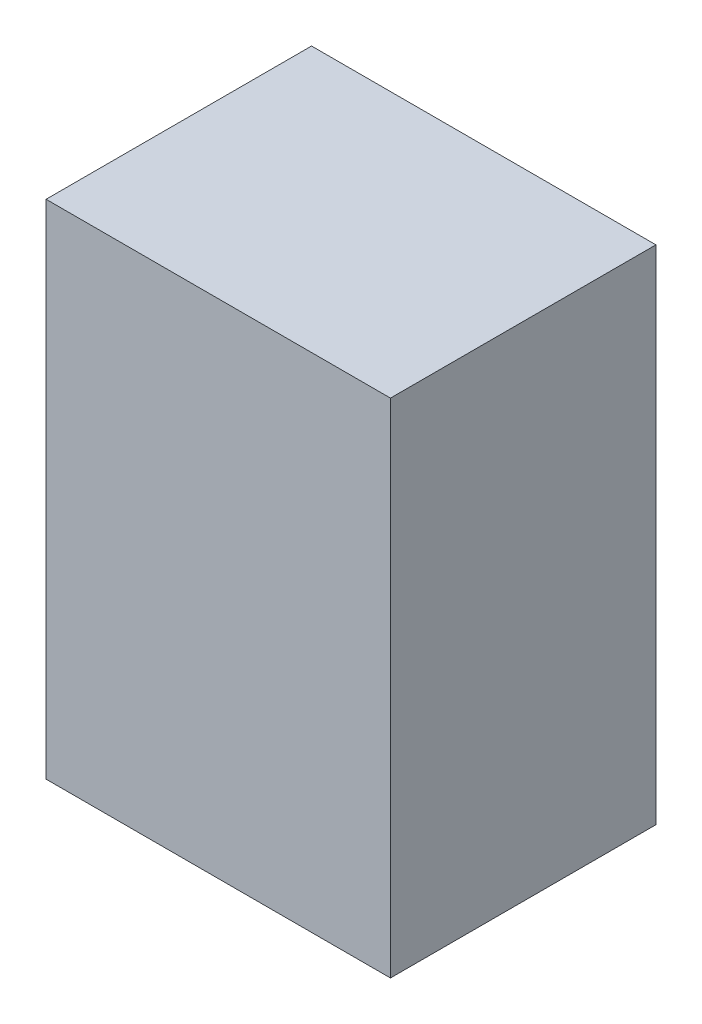
ISO-10303-21;
HEADER;
FILE_DESCRIPTION(('STEP AP214'),'2;1');
FILE_NAME('part.step','',(''),(''),'','','');
FILE_SCHEMA(('AUTOMOTIVE_DESIGN { 1 0 10303 214 1 1 1 1 }'));
ENDSEC;
DATA;
#1=APPLICATION_CONTEXT('core data for automotive mechanical design processes');
#2=APPLICATION_PROTOCOL_DEFINITION('international standard','automotive_design',2000,#1);
#3=PRODUCT_CONTEXT('',#1,'mechanical');
#4=PRODUCT('Part','Part','',(#3));
#5=PRODUCT_RELATED_PRODUCT_CATEGORY('part','',(#4));
#6=PRODUCT_DEFINITION_FORMATION('','',#4);
#7=PRODUCT_DEFINITION_CONTEXT('part definition',#1,'design');
#8=PRODUCT_DEFINITION('design','',#6,#7);
#9=PRODUCT_DEFINITION_SHAPE('','',#8);
#10=(LENGTH_UNIT() NAMED_UNIT(*) SI_UNIT(.MILLI.,.METRE.));
#11=(NAMED_UNIT(*) PLANE_ANGLE_UNIT() SI_UNIT($,.RADIAN.));
#12=(NAMED_UNIT(*) SI_UNIT($,.STERADIAN.) SOLID_ANGLE_UNIT());
#13=UNCERTAINTY_MEASURE_WITH_UNIT(LENGTH_MEASURE(1.E-05),#10,'distance_accuracy_value','');
#14=(GEOMETRIC_REPRESENTATION_CONTEXT(3) GLOBAL_UNCERTAINTY_ASSIGNED_CONTEXT((#13)) GLOBAL_UNIT_ASSIGNED_CONTEXT((#10,
#11,#12)) REPRESENTATION_CONTEXT('',''));
#15=CARTESIAN_POINT('',(0.,0.,0.));
#16=DIRECTION('',(0.,0.,1.));
#17=DIRECTION('',(1.,0.,0.));
#18=AXIS2_PLACEMENT_3D('',#15,#16,#17);
#19=CARTESIAN_POINT('',(2.4,7.,1.85));
#20=DIRECTION('',(-1.,0.,0.));
#21=DIRECTION('',(0.,0.,1.));
#22=AXIS2_PLACEMENT_3D('',#19,#20,#21);
#23=PLANE('',#22);
#24=DIRECTION('',(0.,0.,-1.));
#25=VECTOR('',#24,1.);
#26=CARTESIAN_POINT('',(2.4,0.,1.85));
#27=LINE('',#26,#25);
#28=CARTESIAN_POINT('',(2.4,0.,1.85));
#29=VERTEX_POINT('',#28);
#30=CARTESIAN_POINT('',(2.4,0.,-1.85));
#31=VERTEX_POINT('',#30);
#32=EDGE_CURVE('E99',#29,#31,#27,.T.);
#33=ORIENTED_EDGE('',*,*,#32,.T.);
#34=DIRECTION('',(0.,-1.,0.));
#35=VECTOR('',#34,1.);
#36=CARTESIAN_POINT('',(2.4,7.,-1.85));
#37=LINE('',#36,#35);
#38=CARTESIAN_POINT('',(2.4,7.,-1.85));
#39=VERTEX_POINT('',#38);
#40=EDGE_CURVE('E11',#39,#31,#37,.T.);
#41=ORIENTED_EDGE('',*,*,#40,.F.);
#42=DIRECTION('',(0.,0.,-1.));
#43=VECTOR('',#42,1.);
#44=CARTESIAN_POINT('',(2.4,7.,1.85));
#45=LINE('',#44,#43);
#46=CARTESIAN_POINT('',(2.4,7.,1.85));
#47=VERTEX_POINT('',#46);
#48=EDGE_CURVE('E86',#47,#39,#45,.T.);
#49=ORIENTED_EDGE('',*,*,#48,.F.);
#50=DIRECTION('',(0.,-1.,0.));
#51=VECTOR('',#50,1.);
#52=CARTESIAN_POINT('',(2.4,7.,1.85));
#53=LINE('',#52,#51);
#54=EDGE_CURVE('E96',#47,#29,#53,.T.);
#55=ORIENTED_EDGE('',*,*,#54,.T.);
#56=EDGE_LOOP('',(#33,#41,#49,#55));
#57=FACE_BOUND('',#56,.T.);
#58=ADVANCED_FACE('F40',(#57),#23,.F.);
#59=CARTESIAN_POINT('',(-2.4,7.,-1.85));
#60=DIRECTION('',(0.,0.,1.));
#61=DIRECTION('',(1.,0.,0.));
#62=AXIS2_PLACEMENT_3D('',#59,#60,#61);
#63=PLANE('',#62);
#64=DIRECTION('',(-1.,0.,0.));
#65=VECTOR('',#64,1.);
#66=CARTESIAN_POINT('',(-2.4,0.,-1.85));
#67=LINE('',#66,#65);
#68=CARTESIAN_POINT('',(-2.4,0.,-1.85));
#69=VERTEX_POINT('',#68);
#70=EDGE_CURVE('E95',#31,#69,#67,.T.);
#71=ORIENTED_EDGE('',*,*,#70,.T.);
#72=DIRECTION('',(0.,-1.,0.));
#73=VECTOR('',#72,1.);
#74=CARTESIAN_POINT('',(-2.4,7.,-1.85));
#75=LINE('',#74,#73);
#76=CARTESIAN_POINT('',(-2.4,7.,-1.85));
#77=VERTEX_POINT('',#76);
#78=EDGE_CURVE('E44',#77,#69,#75,.T.);
#79=ORIENTED_EDGE('',*,*,#78,.F.);
#80=DIRECTION('',(-1.,0.,0.));
#81=VECTOR('',#80,1.);
#82=CARTESIAN_POINT('',(-2.4,7.,-1.85));
#83=LINE('',#82,#81);
#84=EDGE_CURVE('E84',#39,#77,#83,.T.);
#85=ORIENTED_EDGE('',*,*,#84,.F.);
#86=ORIENTED_EDGE('',*,*,#40,.T.);
#87=EDGE_LOOP('',(#71,#79,#85,#86));
#88=FACE_BOUND('',#87,.T.);
#89=ADVANCED_FACE('F93',(#88),#63,.F.);
#90=CARTESIAN_POINT('',(-2.4,7.,1.85));
#91=DIRECTION('',(1.,0.,0.));
#92=DIRECTION('',(0.,0.,-1.));
#93=AXIS2_PLACEMENT_3D('',#90,#91,#92);
#94=PLANE('',#93);
#95=DIRECTION('',(0.,0.,1.));
#96=VECTOR('',#95,1.);
#97=CARTESIAN_POINT('',(-2.4,0.,1.85));
#98=LINE('',#97,#96);
#99=CARTESIAN_POINT('',(-2.4,0.,1.85));
#100=VERTEX_POINT('',#99);
#101=EDGE_CURVE('E70',#69,#100,#98,.T.);
#102=ORIENTED_EDGE('',*,*,#101,.T.);
#103=DIRECTION('',(0.,-1.,0.));
#104=VECTOR('',#103,1.);
#105=CARTESIAN_POINT('',(-2.4,7.,1.85));
#106=LINE('',#105,#104);
#107=CARTESIAN_POINT('',(-2.4,7.,1.85));
#108=VERTEX_POINT('',#107);
#109=EDGE_CURVE('E91',#108,#100,#106,.T.);
#110=ORIENTED_EDGE('',*,*,#109,.F.);
#111=DIRECTION('',(0.,0.,1.));
#112=VECTOR('',#111,1.);
#113=CARTESIAN_POINT('',(-2.4,7.,1.85));
#114=LINE('',#113,#112);
#115=EDGE_CURVE('E88',#77,#108,#114,.T.);
#116=ORIENTED_EDGE('',*,*,#115,.F.);
#117=ORIENTED_EDGE('',*,*,#78,.T.);
#118=EDGE_LOOP('',(#102,#110,#116,#117));
#119=FACE_BOUND('',#118,.T.);
#120=ADVANCED_FACE('F94',(#119),#94,.F.);
#121=CARTESIAN_POINT('',(-2.4,7.,1.85));
#122=DIRECTION('',(0.,0.,-1.));
#123=DIRECTION('',(-1.,0.,0.));
#124=AXIS2_PLACEMENT_3D('',#121,#122,#123);
#125=PLANE('',#124);
#126=DIRECTION('',(1.,0.,0.));
#127=VECTOR('',#126,1.);
#128=CARTESIAN_POINT('',(-2.4,0.,1.85));
#129=LINE('',#128,#127);
#130=EDGE_CURVE('E77',#100,#29,#129,.T.);
#131=ORIENTED_EDGE('',*,*,#130,.T.);
#132=ORIENTED_EDGE('',*,*,#54,.F.);
#133=DIRECTION('',(1.,0.,0.));
#134=VECTOR('',#133,1.);
#135=CARTESIAN_POINT('',(-2.4,7.,1.85));
#136=LINE('',#135,#134);
#137=EDGE_CURVE('E52',#108,#47,#136,.T.);
#138=ORIENTED_EDGE('',*,*,#137,.F.);
#139=ORIENTED_EDGE('',*,*,#109,.T.);
#140=EDGE_LOOP('',(#131,#132,#138,#139));
#141=FACE_BOUND('',#140,.T.);
#142=ADVANCED_FACE('F110',(#141),#125,.F.);
#143=CARTESIAN_POINT('',(0.,7.,0.));
#144=DIRECTION('',(0.,-1.,0.));
#145=DIRECTION('',(0.,0.,-1.));
#146=AXIS2_PLACEMENT_3D('',#143,#144,#145);
#147=PLANE('',#146);
#148=ORIENTED_EDGE('',*,*,#48,.T.);
#149=ORIENTED_EDGE('',*,*,#84,.T.);
#150=ORIENTED_EDGE('',*,*,#115,.T.);
#151=ORIENTED_EDGE('',*,*,#137,.T.);
#152=EDGE_LOOP('',(#148,#149,#150,#151));
#153=FACE_BOUND('',#152,.T.);
#154=ADVANCED_FACE('F83',(#153),#147,.F.);
#155=CARTESIAN_POINT('',(0.,0.,0.));
#156=DIRECTION('',(0.,-1.,0.));
#157=DIRECTION('',(0.,0.,-1.));
#158=AXIS2_PLACEMENT_3D('',#155,#156,#157);
#159=PLANE('',#158);
#160=ORIENTED_EDGE('',*,*,#32,.F.);
#161=ORIENTED_EDGE('',*,*,#130,.F.);
#162=ORIENTED_EDGE('',*,*,#101,.F.);
#163=ORIENTED_EDGE('',*,*,#70,.F.);
#164=EDGE_LOOP('',(#160,#161,#162,#163));
#165=FACE_BOUND('',#164,.T.);
#166=ADVANCED_FACE('F109',(#165),#159,.T.);
#167=CLOSED_SHELL('',(#58,#89,#120,#142,#154,#166));
#168=MANIFOLD_SOLID_BREP('B2',#167);
#169=ADVANCED_BREP_SHAPE_REPRESENTATION('',(#18,#168),#14);
#170=SHAPE_DEFINITION_REPRESENTATION(#9,#169);
ENDSEC;
END-ISO-10303-21;
